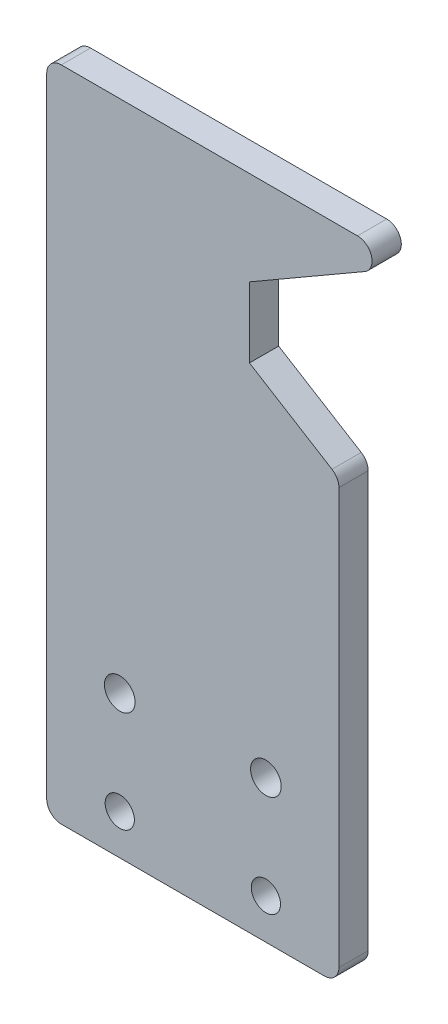
ISO-10303-21;
HEADER;
FILE_DESCRIPTION(('STEP AP214'),'2;1');
FILE_NAME('part.step','',(''),(''),'','','');
FILE_SCHEMA(('AUTOMOTIVE_DESIGN { 1 0 10303 214 1 1 1 1 }'));
ENDSEC;
DATA;
#1=APPLICATION_CONTEXT('core data for automotive mechanical design processes');
#2=APPLICATION_PROTOCOL_DEFINITION('international standard','automotive_design',2000,#1);
#3=PRODUCT_CONTEXT('',#1,'mechanical');
#4=PRODUCT('Part','Part','',(#3));
#5=PRODUCT_RELATED_PRODUCT_CATEGORY('part','',(#4));
#6=PRODUCT_DEFINITION_FORMATION('','',#4);
#7=PRODUCT_DEFINITION_CONTEXT('part definition',#1,'design');
#8=PRODUCT_DEFINITION('design','',#6,#7);
#9=PRODUCT_DEFINITION_SHAPE('','',#8);
#10=(LENGTH_UNIT() NAMED_UNIT(*) SI_UNIT(.MILLI.,.METRE.));
#11=(NAMED_UNIT(*) PLANE_ANGLE_UNIT() SI_UNIT($,.RADIAN.));
#12=(NAMED_UNIT(*) SI_UNIT($,.STERADIAN.) SOLID_ANGLE_UNIT());
#13=UNCERTAINTY_MEASURE_WITH_UNIT(LENGTH_MEASURE(1.E-05),#10,'distance_accuracy_value','');
#14=(GEOMETRIC_REPRESENTATION_CONTEXT(3) GLOBAL_UNCERTAINTY_ASSIGNED_CONTEXT((#13)) GLOBAL_UNIT_ASSIGNED_CONTEXT((#10,
#11,#12)) REPRESENTATION_CONTEXT('',''));
#15=CARTESIAN_POINT('',(0.,0.,0.));
#16=DIRECTION('',(0.,0.,1.));
#17=DIRECTION('',(1.,0.,0.));
#18=AXIS2_PLACEMENT_3D('',#15,#16,#17);
#19=CARTESIAN_POINT('',(0.,0.,4.));
#20=DIRECTION('',(0.,0.,1.));
#21=DIRECTION('',(1.,0.,0.));
#22=AXIS2_PLACEMENT_3D('',#19,#20,#21);
#23=PLANE('',#22);
#24=CARTESIAN_POINT('',(-10.,-24.5,4.));
#25=DIRECTION('',(0.,0.,1.));
#26=DIRECTION('',(1.,0.,0.));
#27=AXIS2_PLACEMENT_3D('',#24,#25,#26);
#28=CIRCLE('',#27,2.);
#29=CARTESIAN_POINT('',(-8.,-24.5,4.));
#30=VERTEX_POINT('',#29);
#31=EDGE_CURVE('E435',#30,#30,#28,.T.);
#32=ORIENTED_EDGE('',*,*,#31,.F.);
#33=EDGE_LOOP('',(#32));
#34=FACE_BOUND('',#33,.T.);
#35=CARTESIAN_POINT('',(10.,-24.5,4.));
#36=DIRECTION('',(0.,0.,1.));
#37=DIRECTION('',(1.,0.,0.));
#38=AXIS2_PLACEMENT_3D('',#35,#36,#37);
#39=CIRCLE('',#38,2.);
#40=CARTESIAN_POINT('',(12.,-24.5,4.));
#41=VERTEX_POINT('',#40);
#42=EDGE_CURVE('E442',#41,#41,#39,.F.);
#43=ORIENTED_EDGE('',*,*,#42,.T.);
#44=EDGE_LOOP('',(#43));
#45=FACE_BOUND('',#44,.T.);
#46=CARTESIAN_POINT('',(-10.,-10.5,4.));
#47=DIRECTION('',(0.,0.,1.));
#48=DIRECTION('',(1.,0.,0.));
#49=AXIS2_PLACEMENT_3D('',#46,#47,#48);
#50=CIRCLE('',#49,2.1);
#51=CARTESIAN_POINT('',(-7.9,-10.5,4.));
#52=VERTEX_POINT('',#51);
#53=EDGE_CURVE('E429',#52,#52,#50,.T.);
#54=ORIENTED_EDGE('',*,*,#53,.F.);
#55=EDGE_LOOP('',(#54));
#56=FACE_BOUND('',#55,.T.);
#57=DIRECTION('',(0.,-1.,0.));
#58=VECTOR('',#57,1.);
#59=CARTESIAN_POINT('',(20.,0.,4.));
#60=LINE('',#59,#58);
#61=CARTESIAN_POINT('',(20.,28.8825568292374,4.));
#62=VERTEX_POINT('',#61);
#63=CARTESIAN_POINT('',(20.,-28.,4.));
#64=VERTEX_POINT('',#63);
#65=EDGE_CURVE('E173',#62,#64,#60,.T.);
#66=ORIENTED_EDGE('',*,*,#65,.F.);
#67=CARTESIAN_POINT('',(18.,28.8825568292374,4.));
#68=DIRECTION('',(0.,0.,1.));
#69=DIRECTION('',(1.,0.,0.));
#70=AXIS2_PLACEMENT_3D('',#67,#68,#69);
#71=CIRCLE('',#70,2.);
#72=CARTESIAN_POINT('',(19.0483859402987,30.5857558546552,4.));
#73=VERTEX_POINT('',#72);
#74=EDGE_CURVE('E224',#62,#73,#71,.T.);
#75=ORIENTED_EDGE('',*,*,#74,.T.);
#76=DIRECTION('',(0.851599512708867,-0.524192970149372,0.));
#77=VECTOR('',#76,1.);
#78=CARTESIAN_POINT('',(18.887639737419,30.6847014602718,4.));
#79=LINE('',#78,#77);
#80=CARTESIAN_POINT('',(7.74934890663777,37.5407572304337,4.));
#81=VERTEX_POINT('',#80);
#82=EDGE_CURVE('E176',#81,#73,#79,.T.);
#83=ORIENTED_EDGE('',*,*,#82,.F.);
#84=DIRECTION('',(0.,-1.,0.));
#85=VECTOR('',#84,1.);
#86=CARTESIAN_POINT('',(7.7493489066378,0.,4.));
#87=LINE('',#86,#85);
#88=CARTESIAN_POINT('',(7.74934890663776,47.153580601603,4.));
#89=VERTEX_POINT('',#88);
#90=EDGE_CURVE('E179',#89,#81,#87,.T.);
#91=ORIENTED_EDGE('',*,*,#90,.F.);
#92=DIRECTION('',(-0.866025403784441,-0.499999999999995,0.));
#93=VECTOR('',#92,1.);
#94=CARTESIAN_POINT('',(-18.4807621135331,32.0096189432337,4.));
#95=LINE('',#94,#93);
#96=CARTESIAN_POINT('',(23.5358983848623,56.2679491924311,4.));
#97=VERTEX_POINT('',#96);
#98=EDGE_CURVE('E160',#97,#89,#95,.T.);
#99=ORIENTED_EDGE('',*,*,#98,.F.);
#100=CARTESIAN_POINT('',(22.5358983848623,58.,4.));
#101=DIRECTION('',(0.,0.,1.));
#102=DIRECTION('',(1.,0.,0.));
#103=AXIS2_PLACEMENT_3D('',#100,#101,#102);
#104=CIRCLE('',#103,2.00000000000001);
#105=CARTESIAN_POINT('',(22.5358983848623,60.,4.));
#106=VERTEX_POINT('',#105);
#107=EDGE_CURVE('E145',#106,#97,#104,.F.);
#108=ORIENTED_EDGE('',*,*,#107,.F.);
#109=DIRECTION('',(1.,0.,0.));
#110=VECTOR('',#109,1.);
#111=CARTESIAN_POINT('',(0.,60.,4.));
#112=LINE('',#111,#110);
#113=CARTESIAN_POINT('',(-17.9999999999999,60.,4.));
#114=VERTEX_POINT('',#113);
#115=EDGE_CURVE('E135',#114,#106,#112,.T.);
#116=ORIENTED_EDGE('',*,*,#115,.F.);
#117=CARTESIAN_POINT('',(-17.9999999999999,58.,4.));
#118=DIRECTION('',(0.,0.,1.));
#119=DIRECTION('',(1.,0.,0.));
#120=AXIS2_PLACEMENT_3D('',#117,#118,#119);
#121=CIRCLE('',#120,2.);
#122=CARTESIAN_POINT('',(-19.9999999999999,58.,4.));
#123=VERTEX_POINT('',#122);
#124=EDGE_CURVE('E219',#114,#123,#121,.T.);
#125=ORIENTED_EDGE('',*,*,#124,.T.);
#126=DIRECTION('',(0.,-1.,0.));
#127=VECTOR('',#126,1.);
#128=CARTESIAN_POINT('',(-20.0000000000001,0.,4.));
#129=LINE('',#128,#127);
#130=CARTESIAN_POINT('',(-20.0000000000002,-28.,4.));
#131=VERTEX_POINT('',#130);
#132=EDGE_CURVE('E144',#123,#131,#129,.T.);
#133=ORIENTED_EDGE('',*,*,#132,.T.);
#134=CARTESIAN_POINT('',(-18.0000000000002,-28.,4.));
#135=DIRECTION('',(0.,0.,1.));
#136=DIRECTION('',(1.,0.,0.));
#137=AXIS2_PLACEMENT_3D('',#134,#135,#136);
#138=CIRCLE('',#137,2.);
#139=CARTESIAN_POINT('',(-18.0000000000002,-30.,4.));
#140=VERTEX_POINT('',#139);
#141=EDGE_CURVE('E67',#131,#140,#138,.T.);
#142=ORIENTED_EDGE('',*,*,#141,.T.);
#143=DIRECTION('',(1.,0.,0.));
#144=VECTOR('',#143,1.);
#145=CARTESIAN_POINT('',(0.,-30.,4.));
#146=LINE('',#145,#144);
#147=CARTESIAN_POINT('',(18.,-30.,4.));
#148=VERTEX_POINT('',#147);
#149=EDGE_CURVE('E171',#140,#148,#146,.T.);
#150=ORIENTED_EDGE('',*,*,#149,.T.);
#151=CARTESIAN_POINT('',(18.,-28.,4.));
#152=DIRECTION('',(0.,0.,1.));
#153=DIRECTION('',(1.,0.,0.));
#154=AXIS2_PLACEMENT_3D('',#151,#152,#153);
#155=CIRCLE('',#154,2.);
#156=EDGE_CURVE('E221',#148,#64,#155,.T.);
#157=ORIENTED_EDGE('',*,*,#156,.T.);
#158=EDGE_LOOP('',(#66,#75,#83,#91,#99,#108,#116,#125,#133,#142,#150,#157));
#159=FACE_BOUND('',#158,.T.);
#160=CARTESIAN_POINT('',(10.,-10.5,4.));
#161=DIRECTION('',(0.,0.,1.));
#162=DIRECTION('',(1.,0.,0.));
#163=AXIS2_PLACEMENT_3D('',#160,#161,#162);
#164=CIRCLE('',#163,2.1);
#165=CARTESIAN_POINT('',(12.1,-10.5,4.));
#166=VERTEX_POINT('',#165);
#167=EDGE_CURVE('E441',#166,#166,#164,.F.);
#168=ORIENTED_EDGE('',*,*,#167,.T.);
#169=EDGE_LOOP('',(#168));
#170=FACE_BOUND('',#169,.T.);
#171=ADVANCED_FACE('F45',(#34,#45,#56,#159,#170),#23,.T.);
#172=CARTESIAN_POINT('',(0.,0.,0.));
#173=DIRECTION('',(0.,0.,1.));
#174=DIRECTION('',(1.,0.,0.));
#175=AXIS2_PLACEMENT_3D('',#172,#173,#174);
#176=PLANE('',#175);
#177=CARTESIAN_POINT('',(-10.,-24.5,0.));
#178=DIRECTION('',(0.,0.,1.));
#179=DIRECTION('',(1.,0.,0.));
#180=AXIS2_PLACEMENT_3D('',#177,#178,#179);
#181=CIRCLE('',#180,2.);
#182=CARTESIAN_POINT('',(-8.,-24.5,0.));
#183=VERTEX_POINT('',#182);
#184=EDGE_CURVE('E433',#183,#183,#181,.F.);
#185=ORIENTED_EDGE('',*,*,#184,.F.);
#186=EDGE_LOOP('',(#185));
#187=FACE_BOUND('',#186,.T.);
#188=CARTESIAN_POINT('',(-10.,-10.5,0.));
#189=DIRECTION('',(0.,0.,1.));
#190=DIRECTION('',(1.,0.,0.));
#191=AXIS2_PLACEMENT_3D('',#188,#189,#190);
#192=CIRCLE('',#191,2.1);
#193=CARTESIAN_POINT('',(-7.9,-10.5,0.));
#194=VERTEX_POINT('',#193);
#195=EDGE_CURVE('E167',#194,#194,#192,.F.);
#196=ORIENTED_EDGE('',*,*,#195,.F.);
#197=EDGE_LOOP('',(#196));
#198=FACE_BOUND('',#197,.T.);
#199=DIRECTION('',(0.851599512708867,-0.524192970149372,0.));
#200=VECTOR('',#199,1.);
#201=CARTESIAN_POINT('',(18.887639737419,30.6847014602718,0.));
#202=LINE('',#201,#200);
#203=CARTESIAN_POINT('',(7.74934890663777,37.5407572304337,0.));
#204=VERTEX_POINT('',#203);
#205=CARTESIAN_POINT('',(19.0483859402987,30.5857558546552,0.));
#206=VERTEX_POINT('',#205);
#207=EDGE_CURVE('E195',#204,#206,#202,.T.);
#208=ORIENTED_EDGE('',*,*,#207,.T.);
#209=CARTESIAN_POINT('',(18.,28.8825568292374,0.));
#210=DIRECTION('',(0.,0.,1.));
#211=DIRECTION('',(1.,0.,0.));
#212=AXIS2_PLACEMENT_3D('',#209,#210,#211);
#213=CIRCLE('',#212,2.);
#214=CARTESIAN_POINT('',(20.,28.8825568292374,0.));
#215=VERTEX_POINT('',#214);
#216=EDGE_CURVE('E212',#206,#215,#213,.F.);
#217=ORIENTED_EDGE('',*,*,#216,.T.);
#218=DIRECTION('',(0.,-1.,0.));
#219=VECTOR('',#218,1.);
#220=CARTESIAN_POINT('',(20.,0.,0.));
#221=LINE('',#220,#219);
#222=CARTESIAN_POINT('',(20.,-28.,0.));
#223=VERTEX_POINT('',#222);
#224=EDGE_CURVE('E192',#215,#223,#221,.T.);
#225=ORIENTED_EDGE('',*,*,#224,.T.);
#226=CARTESIAN_POINT('',(18.,-28.,0.));
#227=DIRECTION('',(0.,0.,1.));
#228=DIRECTION('',(1.,0.,0.));
#229=AXIS2_PLACEMENT_3D('',#226,#227,#228);
#230=CIRCLE('',#229,2.);
#231=CARTESIAN_POINT('',(18.,-30.,0.));
#232=VERTEX_POINT('',#231);
#233=EDGE_CURVE('E208',#223,#232,#230,.F.);
#234=ORIENTED_EDGE('',*,*,#233,.T.);
#235=DIRECTION('',(1.,0.,0.));
#236=VECTOR('',#235,1.);
#237=CARTESIAN_POINT('',(0.,-30.,0.));
#238=LINE('',#237,#236);
#239=CARTESIAN_POINT('',(-18.0000000000002,-30.,0.));
#240=VERTEX_POINT('',#239);
#241=EDGE_CURVE('E190',#240,#232,#238,.T.);
#242=ORIENTED_EDGE('',*,*,#241,.F.);
#243=CARTESIAN_POINT('',(-18.0000000000002,-28.,0.));
#244=DIRECTION('',(0.,0.,1.));
#245=DIRECTION('',(1.,0.,0.));
#246=AXIS2_PLACEMENT_3D('',#243,#244,#245);
#247=CIRCLE('',#246,2.);
#248=CARTESIAN_POINT('',(-20.0000000000002,-28.,0.));
#249=VERTEX_POINT('',#248);
#250=EDGE_CURVE('E210',#240,#249,#247,.F.);
#251=ORIENTED_EDGE('',*,*,#250,.T.);
#252=DIRECTION('',(0.,-1.,0.));
#253=VECTOR('',#252,1.);
#254=CARTESIAN_POINT('',(-20.0000000000001,0.,0.));
#255=LINE('',#254,#253);
#256=CARTESIAN_POINT('',(-19.9999999999999,58.,0.));
#257=VERTEX_POINT('',#256);
#258=EDGE_CURVE('E187',#257,#249,#255,.T.);
#259=ORIENTED_EDGE('',*,*,#258,.F.);
#260=CARTESIAN_POINT('',(-17.9999999999999,58.,0.));
#261=DIRECTION('',(0.,0.,1.));
#262=DIRECTION('',(1.,0.,0.));
#263=AXIS2_PLACEMENT_3D('',#260,#261,#262);
#264=CIRCLE('',#263,2.);
#265=CARTESIAN_POINT('',(-17.9999999999999,60.,0.));
#266=VERTEX_POINT('',#265);
#267=EDGE_CURVE('E206',#257,#266,#264,.F.);
#268=ORIENTED_EDGE('',*,*,#267,.T.);
#269=DIRECTION('',(1.,0.,0.));
#270=VECTOR('',#269,1.);
#271=CARTESIAN_POINT('',(0.,60.,0.));
#272=LINE('',#271,#270);
#273=CARTESIAN_POINT('',(22.5358983848623,60.,0.));
#274=VERTEX_POINT('',#273);
#275=EDGE_CURVE('E185',#266,#274,#272,.T.);
#276=ORIENTED_EDGE('',*,*,#275,.T.);
#277=CARTESIAN_POINT('',(22.5358983848623,58.,0.));
#278=DIRECTION('',(0.,0.,1.));
#279=DIRECTION('',(1.,0.,0.));
#280=AXIS2_PLACEMENT_3D('',#277,#278,#279);
#281=CIRCLE('',#280,2.00000000000001);
#282=CARTESIAN_POINT('',(23.5358983848623,56.2679491924311,0.));
#283=VERTEX_POINT('',#282);
#284=EDGE_CURVE('E152',#274,#283,#281,.F.);
#285=ORIENTED_EDGE('',*,*,#284,.T.);
#286=DIRECTION('',(-0.866025403784441,-0.499999999999995,0.));
#287=VECTOR('',#286,1.);
#288=CARTESIAN_POINT('',(-18.4807621135331,32.0096189432337,0.));
#289=LINE('',#288,#287);
#290=CARTESIAN_POINT('',(7.74934890663776,47.153580601603,0.));
#291=VERTEX_POINT('',#290);
#292=EDGE_CURVE('E161',#283,#291,#289,.T.);
#293=ORIENTED_EDGE('',*,*,#292,.T.);
#294=DIRECTION('',(0.,-1.,0.));
#295=VECTOR('',#294,1.);
#296=CARTESIAN_POINT('',(7.7493489066378,0.,0.));
#297=LINE('',#296,#295);
#298=EDGE_CURVE('E164',#291,#204,#297,.T.);
#299=ORIENTED_EDGE('',*,*,#298,.T.);
#300=EDGE_LOOP('',(#208,#217,#225,#234,#242,#251,#259,#268,#276,#285,#293,#299));
#301=FACE_BOUND('',#300,.T.);
#302=CARTESIAN_POINT('',(10.,-24.5,0.));
#303=DIRECTION('',(0.,0.,1.));
#304=DIRECTION('',(1.,0.,0.));
#305=AXIS2_PLACEMENT_3D('',#302,#303,#304);
#306=CIRCLE('',#305,2.);
#307=CARTESIAN_POINT('',(12.,-24.5,0.));
#308=VERTEX_POINT('',#307);
#309=EDGE_CURVE('E447',#308,#308,#306,.T.);
#310=ORIENTED_EDGE('',*,*,#309,.T.);
#311=EDGE_LOOP('',(#310));
#312=FACE_BOUND('',#311,.T.);
#313=CARTESIAN_POINT('',(10.,-10.5,0.));
#314=DIRECTION('',(0.,0.,1.));
#315=DIRECTION('',(1.,0.,0.));
#316=AXIS2_PLACEMENT_3D('',#313,#314,#315);
#317=CIRCLE('',#316,2.1);
#318=CARTESIAN_POINT('',(12.1,-10.5,0.));
#319=VERTEX_POINT('',#318);
#320=EDGE_CURVE('E438',#319,#319,#317,.T.);
#321=ORIENTED_EDGE('',*,*,#320,.T.);
#322=EDGE_LOOP('',(#321));
#323=FACE_BOUND('',#322,.T.);
#324=ADVANCED_FACE('F244',(#187,#198,#301,#312,#323),#176,.F.);
#325=CARTESIAN_POINT('',(22.5358983848623,58.,4.));
#326=DIRECTION('',(0.,0.,-1.));
#327=DIRECTION('',(-1.,0.,0.));
#328=AXIS2_PLACEMENT_3D('',#325,#326,#327);
#329=CYLINDRICAL_SURFACE('',#328,2.00000000000001);
#330=ORIENTED_EDGE('',*,*,#284,.F.);
#331=DIRECTION('',(0.,0.,-1.));
#332=VECTOR('',#331,1.);
#333=CARTESIAN_POINT('',(22.5358983848623,60.,4.));
#334=LINE('',#333,#332);
#335=EDGE_CURVE('E139',#106,#274,#334,.T.);
#336=ORIENTED_EDGE('',*,*,#335,.F.);
#337=ORIENTED_EDGE('',*,*,#107,.T.);
#338=DIRECTION('',(0.,0.,-1.));
#339=VECTOR('',#338,1.);
#340=CARTESIAN_POINT('',(23.5358983848623,56.2679491924311,4.));
#341=LINE('',#340,#339);
#342=EDGE_CURVE('E183',#97,#283,#341,.T.);
#343=ORIENTED_EDGE('',*,*,#342,.T.);
#344=EDGE_LOOP('',(#330,#336,#337,#343));
#345=FACE_BOUND('',#344,.T.);
#346=ADVANCED_FACE('F149',(#345),#329,.T.);
#347=CARTESIAN_POINT('',(0.,60.,4.));
#348=DIRECTION('',(0.,1.,0.));
#349=DIRECTION('',(-1.,0.,0.));
#350=AXIS2_PLACEMENT_3D('',#347,#348,#349);
#351=PLANE('',#350);
#352=ORIENTED_EDGE('',*,*,#275,.F.);
#353=DIRECTION('',(0.,0.,-1.));
#354=VECTOR('',#353,1.);
#355=CARTESIAN_POINT('',(-17.9999999999999,60.,4.));
#356=LINE('',#355,#354);
#357=EDGE_CURVE('E11',#266,#114,#356,.F.);
#358=ORIENTED_EDGE('',*,*,#357,.T.);
#359=ORIENTED_EDGE('',*,*,#115,.T.);
#360=ORIENTED_EDGE('',*,*,#335,.T.);
#361=EDGE_LOOP('',(#352,#358,#359,#360));
#362=FACE_BOUND('',#361,.T.);
#363=ADVANCED_FACE('F138',(#362),#351,.T.);
#364=CARTESIAN_POINT('',(-20.0000000000001,0.,4.));
#365=DIRECTION('',(1.,0.,0.));
#366=DIRECTION('',(0.,1.,0.));
#367=AXIS2_PLACEMENT_3D('',#364,#365,#366);
#368=PLANE('',#367);
#369=ORIENTED_EDGE('',*,*,#258,.T.);
#370=DIRECTION('',(0.,0.,-1.));
#371=VECTOR('',#370,1.);
#372=CARTESIAN_POINT('',(-20.0000000000002,-28.,4.));
#373=LINE('',#372,#371);
#374=EDGE_CURVE('E53',#249,#131,#373,.F.);
#375=ORIENTED_EDGE('',*,*,#374,.T.);
#376=ORIENTED_EDGE('',*,*,#132,.F.);
#377=DIRECTION('',(0.,0.,-1.));
#378=VECTOR('',#377,1.);
#379=CARTESIAN_POINT('',(-19.9999999999999,58.,0.));
#380=LINE('',#379,#378);
#381=EDGE_CURVE('E230',#123,#257,#380,.T.);
#382=ORIENTED_EDGE('',*,*,#381,.T.);
#383=EDGE_LOOP('',(#369,#375,#376,#382));
#384=FACE_BOUND('',#383,.T.);
#385=ADVANCED_FACE('F235',(#384),#368,.F.);
#386=CARTESIAN_POINT('',(0.,-30.,4.));
#387=DIRECTION('',(0.,1.,0.));
#388=DIRECTION('',(0.,0.,1.));
#389=AXIS2_PLACEMENT_3D('',#386,#387,#388);
#390=PLANE('',#389);
#391=ORIENTED_EDGE('',*,*,#149,.F.);
#392=DIRECTION('',(0.,0.,-1.));
#393=VECTOR('',#392,1.);
#394=CARTESIAN_POINT('',(-18.0000000000002,-30.,4.));
#395=LINE('',#394,#393);
#396=EDGE_CURVE('E227',#140,#240,#395,.T.);
#397=ORIENTED_EDGE('',*,*,#396,.T.);
#398=ORIENTED_EDGE('',*,*,#241,.T.);
#399=DIRECTION('',(0.,0.,-1.));
#400=VECTOR('',#399,1.);
#401=CARTESIAN_POINT('',(18.,-30.,4.));
#402=LINE('',#401,#400);
#403=EDGE_CURVE('E60',#232,#148,#402,.F.);
#404=ORIENTED_EDGE('',*,*,#403,.T.);
#405=EDGE_LOOP('',(#391,#397,#398,#404));
#406=FACE_BOUND('',#405,.T.);
#407=ADVANCED_FACE('F242',(#406),#390,.F.);
#408=CARTESIAN_POINT('',(20.,0.,4.));
#409=DIRECTION('',(1.,0.,0.));
#410=DIRECTION('',(0.,1.,0.));
#411=AXIS2_PLACEMENT_3D('',#408,#409,#410);
#412=PLANE('',#411);
#413=ORIENTED_EDGE('',*,*,#224,.F.);
#414=DIRECTION('',(0.,0.,-1.));
#415=VECTOR('',#414,1.);
#416=CARTESIAN_POINT('',(20.,28.8825568292374,4.));
#417=LINE('',#416,#415);
#418=EDGE_CURVE('E217',#215,#62,#417,.F.);
#419=ORIENTED_EDGE('',*,*,#418,.T.);
#420=ORIENTED_EDGE('',*,*,#65,.T.);
#421=DIRECTION('',(0.,0.,-1.));
#422=VECTOR('',#421,1.);
#423=CARTESIAN_POINT('',(20.,-28.,0.));
#424=LINE('',#423,#422);
#425=EDGE_CURVE('E214',#64,#223,#424,.T.);
#426=ORIENTED_EDGE('',*,*,#425,.T.);
#427=EDGE_LOOP('',(#413,#419,#420,#426));
#428=FACE_BOUND('',#427,.T.);
#429=ADVANCED_FACE('F252',(#428),#412,.T.);
#430=CARTESIAN_POINT('',(18.887639737419,30.6847014602718,4.));
#431=DIRECTION('',(0.524192970149372,0.851599512708867,0.));
#432=DIRECTION('',(-0.851599512708867,0.524192970149372,0.));
#433=AXIS2_PLACEMENT_3D('',#430,#431,#432);
#434=PLANE('',#433);
#435=ORIENTED_EDGE('',*,*,#82,.T.);
#436=DIRECTION('',(0.,0.,-1.));
#437=VECTOR('',#436,1.);
#438=CARTESIAN_POINT('',(19.0483859402987,30.5857558546552,4.));
#439=LINE('',#438,#437);
#440=EDGE_CURVE('E153',#73,#206,#439,.T.);
#441=ORIENTED_EDGE('',*,*,#440,.T.);
#442=ORIENTED_EDGE('',*,*,#207,.F.);
#443=DIRECTION('',(0.,0.,-1.));
#444=VECTOR('',#443,1.);
#445=CARTESIAN_POINT('',(7.74934890663777,37.5407572304337,4.));
#446=LINE('',#445,#444);
#447=EDGE_CURVE('E154',#81,#204,#446,.T.);
#448=ORIENTED_EDGE('',*,*,#447,.F.);
#449=EDGE_LOOP('',(#435,#441,#442,#448));
#450=FACE_BOUND('',#449,.T.);
#451=ADVANCED_FACE('F261',(#450),#434,.T.);
#452=CARTESIAN_POINT('',(7.7493489066378,0.,4.));
#453=DIRECTION('',(1.,0.,0.));
#454=DIRECTION('',(0.,1.,0.));
#455=AXIS2_PLACEMENT_3D('',#452,#453,#454);
#456=PLANE('',#455);
#457=ORIENTED_EDGE('',*,*,#298,.F.);
#458=DIRECTION('',(0.,0.,-1.));
#459=VECTOR('',#458,1.);
#460=CARTESIAN_POINT('',(7.74934890663776,47.153580601603,4.));
#461=LINE('',#460,#459);
#462=EDGE_CURVE('E201',#89,#291,#461,.T.);
#463=ORIENTED_EDGE('',*,*,#462,.F.);
#464=ORIENTED_EDGE('',*,*,#90,.T.);
#465=ORIENTED_EDGE('',*,*,#447,.T.);
#466=EDGE_LOOP('',(#457,#463,#464,#465));
#467=FACE_BOUND('',#466,.T.);
#468=ADVANCED_FACE('F265',(#467),#456,.T.);
#469=CARTESIAN_POINT('',(-18.4807621135331,32.0096189432337,4.));
#470=DIRECTION('',(0.499999999999995,-0.866025403784441,0.));
#471=DIRECTION('',(0.866025403784441,0.499999999999995,0.));
#472=AXIS2_PLACEMENT_3D('',#469,#470,#471);
#473=PLANE('',#472);
#474=ORIENTED_EDGE('',*,*,#292,.F.);
#475=ORIENTED_EDGE('',*,*,#342,.F.);
#476=ORIENTED_EDGE('',*,*,#98,.T.);
#477=ORIENTED_EDGE('',*,*,#462,.T.);
#478=EDGE_LOOP('',(#474,#475,#476,#477));
#479=FACE_BOUND('',#478,.T.);
#480=ADVANCED_FACE('F267',(#479),#473,.T.);
#481=CARTESIAN_POINT('',(-10.,-10.5,-0.00100000000000013));
#482=DIRECTION('',(0.,0.,1.));
#483=DIRECTION('',(1.,0.,0.));
#484=AXIS2_PLACEMENT_3D('',#481,#482,#483);
#485=CYLINDRICAL_SURFACE('',#484,2.1);
#486=ORIENTED_EDGE('',*,*,#53,.T.);
#487=EDGE_LOOP('',(#486));
#488=FACE_BOUND('',#487,.T.);
#489=ORIENTED_EDGE('',*,*,#195,.T.);
#490=EDGE_LOOP('',(#489));
#491=FACE_BOUND('',#490,.T.);
#492=ADVANCED_FACE('F285',(#488,#491),#485,.F.);
#493=CARTESIAN_POINT('',(10.,-24.5,-0.00100000000000013));
#494=DIRECTION('',(0.,0.,1.));
#495=DIRECTION('',(1.,0.,0.));
#496=AXIS2_PLACEMENT_3D('',#493,#494,#495);
#497=CYLINDRICAL_SURFACE('',#496,2.);
#498=ORIENTED_EDGE('',*,*,#42,.F.);
#499=EDGE_LOOP('',(#498));
#500=FACE_BOUND('',#499,.T.);
#501=ORIENTED_EDGE('',*,*,#309,.F.);
#502=EDGE_LOOP('',(#501));
#503=FACE_BOUND('',#502,.T.);
#504=ADVANCED_FACE('F343',(#500,#503),#497,.F.);
#505=CARTESIAN_POINT('',(10.,-10.5,-0.00100000000000013));
#506=DIRECTION('',(0.,0.,1.));
#507=DIRECTION('',(1.,0.,0.));
#508=AXIS2_PLACEMENT_3D('',#505,#506,#507);
#509=CYLINDRICAL_SURFACE('',#508,2.1);
#510=ORIENTED_EDGE('',*,*,#167,.F.);
#511=EDGE_LOOP('',(#510));
#512=FACE_BOUND('',#511,.T.);
#513=ORIENTED_EDGE('',*,*,#320,.F.);
#514=EDGE_LOOP('',(#513));
#515=FACE_BOUND('',#514,.T.);
#516=ADVANCED_FACE('F334',(#512,#515),#509,.F.);
#517=CARTESIAN_POINT('',(-10.,-24.5,-0.00100000000000013));
#518=DIRECTION('',(0.,0.,1.));
#519=DIRECTION('',(1.,0.,0.));
#520=AXIS2_PLACEMENT_3D('',#517,#518,#519);
#521=CYLINDRICAL_SURFACE('',#520,2.);
#522=ORIENTED_EDGE('',*,*,#31,.T.);
#523=EDGE_LOOP('',(#522));
#524=FACE_BOUND('',#523,.T.);
#525=ORIENTED_EDGE('',*,*,#184,.T.);
#526=EDGE_LOOP('',(#525));
#527=FACE_BOUND('',#526,.T.);
#528=ADVANCED_FACE('F306',(#524,#527),#521,.F.);
#529=CARTESIAN_POINT('',(18.,28.8825568292374,4.));
#530=DIRECTION('',(0.,0.,-1.));
#531=DIRECTION('',(-1.,0.,0.));
#532=AXIS2_PLACEMENT_3D('',#529,#530,#531);
#533=CYLINDRICAL_SURFACE('',#532,2.);
#534=ORIENTED_EDGE('',*,*,#74,.F.);
#535=ORIENTED_EDGE('',*,*,#418,.F.);
#536=ORIENTED_EDGE('',*,*,#216,.F.);
#537=ORIENTED_EDGE('',*,*,#440,.F.);
#538=EDGE_LOOP('',(#534,#535,#536,#537));
#539=FACE_BOUND('',#538,.T.);
#540=ADVANCED_FACE('F258',(#539),#533,.T.);
#541=CARTESIAN_POINT('',(-18.0000000000002,-28.,4.));
#542=DIRECTION('',(0.,0.,-1.));
#543=DIRECTION('',(-1.,0.,0.));
#544=AXIS2_PLACEMENT_3D('',#541,#542,#543);
#545=CYLINDRICAL_SURFACE('',#544,2.);
#546=ORIENTED_EDGE('',*,*,#141,.F.);
#547=ORIENTED_EDGE('',*,*,#374,.F.);
#548=ORIENTED_EDGE('',*,*,#250,.F.);
#549=ORIENTED_EDGE('',*,*,#396,.F.);
#550=EDGE_LOOP('',(#546,#547,#548,#549));
#551=FACE_BOUND('',#550,.T.);
#552=ADVANCED_FACE('F240',(#551),#545,.T.);
#553=CARTESIAN_POINT('',(18.,-28.,4.));
#554=DIRECTION('',(0.,0.,1.));
#555=DIRECTION('',(1.,0.,0.));
#556=AXIS2_PLACEMENT_3D('',#553,#554,#555);
#557=CYLINDRICAL_SURFACE('',#556,2.);
#558=ORIENTED_EDGE('',*,*,#156,.F.);
#559=ORIENTED_EDGE('',*,*,#403,.F.);
#560=ORIENTED_EDGE('',*,*,#233,.F.);
#561=ORIENTED_EDGE('',*,*,#425,.F.);
#562=EDGE_LOOP('',(#558,#559,#560,#561));
#563=FACE_BOUND('',#562,.T.);
#564=ADVANCED_FACE('F250',(#563),#557,.T.);
#565=CARTESIAN_POINT('',(-17.9999999999999,58.,4.));
#566=DIRECTION('',(0.,0.,1.));
#567=DIRECTION('',(1.,0.,0.));
#568=AXIS2_PLACEMENT_3D('',#565,#566,#567);
#569=CYLINDRICAL_SURFACE('',#568,2.);
#570=ORIENTED_EDGE('',*,*,#124,.F.);
#571=ORIENTED_EDGE('',*,*,#357,.F.);
#572=ORIENTED_EDGE('',*,*,#267,.F.);
#573=ORIENTED_EDGE('',*,*,#381,.F.);
#574=EDGE_LOOP('',(#570,#571,#572,#573));
#575=FACE_BOUND('',#574,.T.);
#576=ADVANCED_FACE('F47',(#575),#569,.T.);
#577=CLOSED_SHELL('',(#171,#324,#346,#363,#385,#407,#429,#451,#468,#480,#492,#504,#516,#528,
#540,#552,#564,#576));
#578=MANIFOLD_SOLID_BREP('B2',#577);
#579=ADVANCED_BREP_SHAPE_REPRESENTATION('',(#18,#578),#14);
#580=SHAPE_DEFINITION_REPRESENTATION(#9,#579);
ENDSEC;
END-ISO-10303-21;
